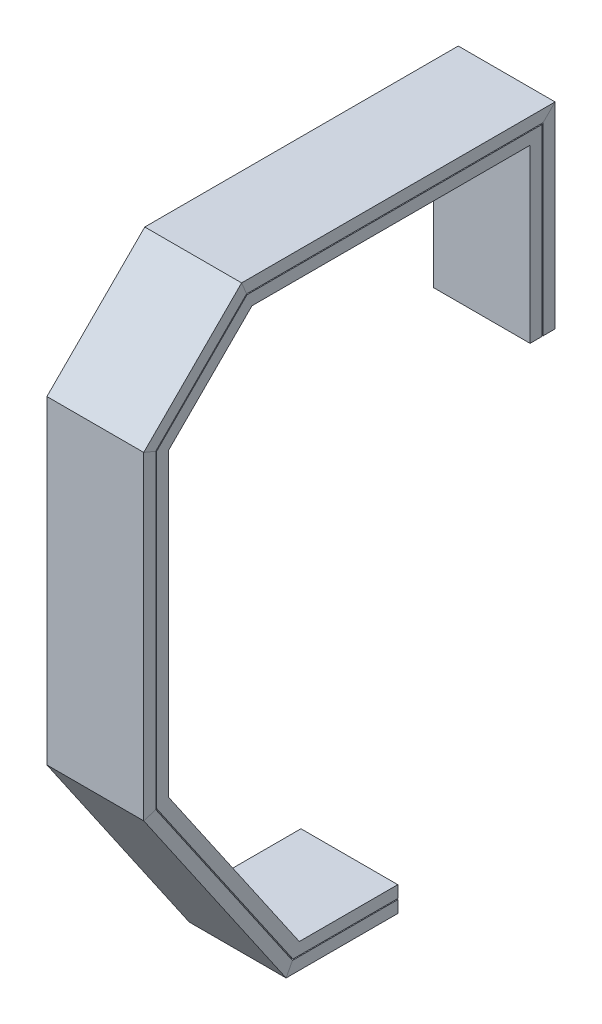
ISO-10303-21;
HEADER;
FILE_DESCRIPTION(('STEP AP214'),'2;1');
FILE_NAME('part.step','',(''),(''),'','','');
FILE_SCHEMA(('AUTOMOTIVE_DESIGN { 1 0 10303 214 1 1 1 1 }'));
ENDSEC;
DATA;
#1=APPLICATION_CONTEXT('core data for automotive mechanical design processes');
#2=APPLICATION_PROTOCOL_DEFINITION('international standard','automotive_design',2000,#1);
#3=PRODUCT_CONTEXT('',#1,'mechanical');
#4=PRODUCT('Part','Part','',(#3));
#5=PRODUCT_RELATED_PRODUCT_CATEGORY('part','',(#4));
#6=PRODUCT_DEFINITION_FORMATION('','',#4);
#7=PRODUCT_DEFINITION_CONTEXT('part definition',#1,'design');
#8=PRODUCT_DEFINITION('design','',#6,#7);
#9=PRODUCT_DEFINITION_SHAPE('','',#8);
#10=(LENGTH_UNIT() NAMED_UNIT(*) SI_UNIT(.MILLI.,.METRE.));
#11=(NAMED_UNIT(*) PLANE_ANGLE_UNIT() SI_UNIT($,.RADIAN.));
#12=(NAMED_UNIT(*) SI_UNIT($,.STERADIAN.) SOLID_ANGLE_UNIT());
#13=UNCERTAINTY_MEASURE_WITH_UNIT(LENGTH_MEASURE(1.E-05),#10,'distance_accuracy_value','');
#14=(GEOMETRIC_REPRESENTATION_CONTEXT(3) GLOBAL_UNCERTAINTY_ASSIGNED_CONTEXT((#13)) GLOBAL_UNIT_ASSIGNED_CONTEXT((#10,
#11,#12)) REPRESENTATION_CONTEXT('',''));
#15=CARTESIAN_POINT('',(0.,0.,0.));
#16=DIRECTION('',(0.,0.,1.));
#17=DIRECTION('',(1.,0.,0.));
#18=AXIS2_PLACEMENT_3D('',#15,#16,#17);
#19=CARTESIAN_POINT('',(25.4,0.,3.655));
#20=DIRECTION('',(0.,-1.,0.));
#21=DIRECTION('',(0.,0.,-1.));
#22=AXIS2_PLACEMENT_3D('',#19,#20,#21);
#23=PLANE('',#22);
#24=DIRECTION('',(0.,0.,1.));
#25=VECTOR('',#24,1.);
#26=CARTESIAN_POINT('',(-25.4,0.,3.655));
#27=LINE('',#26,#25);
#28=CARTESIAN_POINT('',(-25.4,0.,3.655));
#29=VERTEX_POINT('',#28);
#30=CARTESIAN_POINT('',(-25.4,0.,9.965));
#31=VERTEX_POINT('',#30);
#32=EDGE_CURVE('E178',#29,#31,#27,.T.);
#33=ORIENTED_EDGE('',*,*,#32,.F.);
#34=DIRECTION('',(-1.,0.,0.));
#35=VECTOR('',#34,1.);
#36=CARTESIAN_POINT('',(25.4,0.,3.655));
#37=LINE('',#36,#35);
#38=CARTESIAN_POINT('',(25.4,0.,3.655));
#39=VERTEX_POINT('',#38);
#40=EDGE_CURVE('E12',#39,#29,#37,.T.);
#41=ORIENTED_EDGE('',*,*,#40,.F.);
#42=DIRECTION('',(0.,0.,1.));
#43=VECTOR('',#42,1.);
#44=CARTESIAN_POINT('',(25.4,0.,3.655));
#45=LINE('',#44,#43);
#46=CARTESIAN_POINT('',(25.4,0.,9.965));
#47=VERTEX_POINT('',#46);
#48=EDGE_CURVE('E216',#39,#47,#45,.T.);
#49=ORIENTED_EDGE('',*,*,#48,.T.);
#50=DIRECTION('',(-1.,0.,0.));
#51=VECTOR('',#50,1.);
#52=CARTESIAN_POINT('',(25.4,0.,9.965));
#53=LINE('',#52,#51);
#54=EDGE_CURVE('E48',#47,#31,#53,.T.);
#55=ORIENTED_EDGE('',*,*,#54,.T.);
#56=EDGE_LOOP('',(#33,#41,#49,#55));
#57=FACE_BOUND('',#56,.T.);
#58=ADVANCED_FACE('F45',(#57),#23,.T.);
#59=CARTESIAN_POINT('',(25.4,0.,3.655));
#60=DIRECTION('',(0.,0.,-1.));
#61=DIRECTION('',(-1.,0.,0.));
#62=AXIS2_PLACEMENT_3D('',#59,#60,#61);
#63=PLANE('',#62);
#64=DIRECTION('',(0.,-1.,0.));
#65=VECTOR('',#64,1.);
#66=CARTESIAN_POINT('',(-25.4,0.,3.655));
#67=LINE('',#66,#65);
#68=CARTESIAN_POINT('',(-25.4,96.345,3.655));
#69=VERTEX_POINT('',#68);
#70=EDGE_CURVE('E214',#69,#29,#67,.T.);
#71=ORIENTED_EDGE('',*,*,#70,.F.);
#72=DIRECTION('',(-1.,0.,0.));
#73=VECTOR('',#72,1.);
#74=CARTESIAN_POINT('',(25.4,96.345,3.655));
#75=LINE('',#74,#73);
#76=CARTESIAN_POINT('',(25.4,96.345,3.655));
#77=VERTEX_POINT('',#76);
#78=EDGE_CURVE('E54',#77,#69,#75,.T.);
#79=ORIENTED_EDGE('',*,*,#78,.F.);
#80=DIRECTION('',(0.,-1.,0.));
#81=VECTOR('',#80,1.);
#82=CARTESIAN_POINT('',(25.4,0.,3.655));
#83=LINE('',#82,#81);
#84=EDGE_CURVE('E168',#77,#39,#83,.T.);
#85=ORIENTED_EDGE('',*,*,#84,.T.);
#86=ORIENTED_EDGE('',*,*,#40,.T.);
#87=EDGE_LOOP('',(#71,#79,#85,#86));
#88=FACE_BOUND('',#87,.T.);
#89=ADVANCED_FACE('F240',(#88),#63,.T.);
#90=CARTESIAN_POINT('',(25.4,96.345,3.655));
#91=DIRECTION('',(0.,1.,0.));
#92=DIRECTION('',(0.,0.,1.));
#93=AXIS2_PLACEMENT_3D('',#90,#91,#92);
#94=PLANE('',#93);
#95=DIRECTION('',(0.,0.,-1.));
#96=VECTOR('',#95,1.);
#97=CARTESIAN_POINT('',(-25.4,96.345,3.655));
#98=LINE('',#97,#96);
#99=CARTESIAN_POINT('',(-25.4,96.345,158.486049429526));
#100=VERTEX_POINT('',#99);
#101=EDGE_CURVE('E155',#100,#69,#98,.T.);
#102=ORIENTED_EDGE('',*,*,#101,.F.);
#103=DIRECTION('',(-1.,0.,0.));
#104=VECTOR('',#103,1.);
#105=CARTESIAN_POINT('',(25.4,96.345,158.486049429526));
#106=LINE('',#105,#104);
#107=CARTESIAN_POINT('',(25.4,96.345,158.486049429526));
#108=VERTEX_POINT('',#107);
#109=EDGE_CURVE('E150',#108,#100,#106,.T.);
#110=ORIENTED_EDGE('',*,*,#109,.F.);
#111=DIRECTION('',(0.,0.,-1.));
#112=VECTOR('',#111,1.);
#113=CARTESIAN_POINT('',(25.4,96.345,3.655));
#114=LINE('',#113,#112);
#115=EDGE_CURVE('E153',#108,#77,#114,.T.);
#116=ORIENTED_EDGE('',*,*,#115,.T.);
#117=ORIENTED_EDGE('',*,*,#78,.T.);
#118=EDGE_LOOP('',(#102,#110,#116,#117));
#119=FACE_BOUND('',#118,.T.);
#120=ADVANCED_FACE('F152',(#119),#94,.T.);
#121=CARTESIAN_POINT('',(25.4,96.345,158.486049429526));
#122=DIRECTION('',(0.,0.707106781186548,0.707106781186548));
#123=DIRECTION('',(0.,-0.707106781186548,0.707106781186548));
#124=AXIS2_PLACEMENT_3D('',#121,#122,#123);
#125=PLANE('',#124);
#126=DIRECTION('',(0.,0.707106781186547,-0.707106781186547));
#127=VECTOR('',#126,1.);
#128=CARTESIAN_POINT('',(-25.4,96.345,158.486049429526));
#129=LINE('',#128,#127);
#130=CARTESIAN_POINT('',(-25.4,48.9885747464681,205.842474683058));
#131=VERTEX_POINT('',#130);
#132=EDGE_CURVE('E211',#131,#100,#129,.T.);
#133=ORIENTED_EDGE('',*,*,#132,.F.);
#134=DIRECTION('',(-1.,0.,0.));
#135=VECTOR('',#134,1.);
#136=CARTESIAN_POINT('',(25.4,48.9885747464681,205.842474683058));
#137=LINE('',#136,#135);
#138=CARTESIAN_POINT('',(25.4,48.9885747464681,205.842474683058));
#139=VERTEX_POINT('',#138);
#140=EDGE_CURVE('E160',#139,#131,#137,.T.);
#141=ORIENTED_EDGE('',*,*,#140,.F.);
#142=DIRECTION('',(0.,0.707106781186547,-0.707106781186547));
#143=VECTOR('',#142,1.);
#144=CARTESIAN_POINT('',(25.4,96.345,158.486049429526));
#145=LINE('',#144,#143);
#146=EDGE_CURVE('E166',#139,#108,#145,.T.);
#147=ORIENTED_EDGE('',*,*,#146,.T.);
#148=ORIENTED_EDGE('',*,*,#109,.T.);
#149=EDGE_LOOP('',(#133,#141,#147,#148));
#150=FACE_BOUND('',#149,.T.);
#151=ADVANCED_FACE('F170',(#150),#125,.T.);
#152=CARTESIAN_POINT('',(25.4,48.9885747464681,205.842474683058));
#153=DIRECTION('',(0.,0.,1.));
#154=DIRECTION('',(0.,-1.,0.));
#155=AXIS2_PLACEMENT_3D('',#152,#153,#154);
#156=PLANE('',#155);
#157=DIRECTION('',(0.,1.,0.));
#158=VECTOR('',#157,1.);
#159=CARTESIAN_POINT('',(-25.4,48.9885747464681,205.842474683058));
#160=LINE('',#159,#158);
#161=CARTESIAN_POINT('',(-25.4,-113.473168770734,205.842474683058));
#162=VERTEX_POINT('',#161);
#163=EDGE_CURVE('E208',#162,#131,#160,.T.);
#164=ORIENTED_EDGE('',*,*,#163,.F.);
#165=DIRECTION('',(-1.,0.,0.));
#166=VECTOR('',#165,1.);
#167=CARTESIAN_POINT('',(25.4,-113.473168770734,205.842474683058));
#168=LINE('',#167,#166);
#169=CARTESIAN_POINT('',(25.4,-113.473168770734,205.842474683058));
#170=VERTEX_POINT('',#169);
#171=EDGE_CURVE('E220',#170,#162,#168,.T.);
#172=ORIENTED_EDGE('',*,*,#171,.F.);
#173=DIRECTION('',(0.,1.,0.));
#174=VECTOR('',#173,1.);
#175=CARTESIAN_POINT('',(25.4,48.9885747464681,205.842474683058));
#176=LINE('',#175,#174);
#177=EDGE_CURVE('E171',#170,#139,#176,.T.);
#178=ORIENTED_EDGE('',*,*,#177,.T.);
#179=ORIENTED_EDGE('',*,*,#140,.T.);
#180=EDGE_LOOP('',(#164,#172,#178,#179));
#181=FACE_BOUND('',#180,.T.);
#182=ADVANCED_FACE('F253',(#181),#156,.T.);
#183=CARTESIAN_POINT('',(25.4,-113.473168770734,205.842474683058));
#184=DIRECTION('',(0.,-0.566158696964165,0.82429626339796));
#185=DIRECTION('',(0.,-0.82429626339796,-0.566158696964165));
#186=AXIS2_PLACEMENT_3D('',#183,#184,#185);
#187=PLANE('',#186);
#188=DIRECTION('',(0.,0.82429626339796,0.566158696964165));
#189=VECTOR('',#188,1.);
#190=CARTESIAN_POINT('',(-25.4,-113.473168770734,205.842474683058));
#191=LINE('',#190,#189);
#192=CARTESIAN_POINT('',(-25.4,-217.522474683058,134.377369148657));
#193=VERTEX_POINT('',#192);
#194=EDGE_CURVE('E205',#193,#162,#191,.T.);
#195=ORIENTED_EDGE('',*,*,#194,.F.);
#196=DIRECTION('',(-1.,0.,0.));
#197=VECTOR('',#196,1.);
#198=CARTESIAN_POINT('',(25.4,-217.522474683058,134.377369148657));
#199=LINE('',#198,#197);
#200=CARTESIAN_POINT('',(25.4,-217.522474683058,134.377369148657));
#201=VERTEX_POINT('',#200);
#202=EDGE_CURVE('E222',#201,#193,#199,.T.);
#203=ORIENTED_EDGE('',*,*,#202,.F.);
#204=DIRECTION('',(0.,0.82429626339796,0.566158696964165));
#205=VECTOR('',#204,1.);
#206=CARTESIAN_POINT('',(25.4,-113.473168770734,205.842474683058));
#207=LINE('',#206,#205);
#208=EDGE_CURVE('E173',#201,#170,#207,.T.);
#209=ORIENTED_EDGE('',*,*,#208,.T.);
#210=ORIENTED_EDGE('',*,*,#171,.T.);
#211=EDGE_LOOP('',(#195,#203,#209,#210));
#212=FACE_BOUND('',#211,.T.);
#213=ADVANCED_FACE('F256',(#212),#187,.T.);
#214=CARTESIAN_POINT('',(25.4,-217.522474683058,134.377369148657));
#215=DIRECTION('',(0.,-1.,0.));
#216=DIRECTION('',(0.,0.,-1.));
#217=AXIS2_PLACEMENT_3D('',#214,#215,#216);
#218=PLANE('',#217);
#219=DIRECTION('',(0.,0.,1.));
#220=VECTOR('',#219,1.);
#221=CARTESIAN_POINT('',(-25.4,-217.522474683058,134.377369148657));
#222=LINE('',#221,#220);
#223=CARTESIAN_POINT('',(-25.4,-217.522474683058,79.3710585222564));
#224=VERTEX_POINT('',#223);
#225=EDGE_CURVE('E202',#224,#193,#222,.T.);
#226=ORIENTED_EDGE('',*,*,#225,.F.);
#227=DIRECTION('',(-1.,0.,0.));
#228=VECTOR('',#227,1.);
#229=CARTESIAN_POINT('',(25.4,-217.522474683058,79.3710585222564));
#230=LINE('',#229,#228);
#231=CARTESIAN_POINT('',(25.4,-217.522474683058,79.3710585222564));
#232=VERTEX_POINT('',#231);
#233=EDGE_CURVE('E224',#232,#224,#230,.T.);
#234=ORIENTED_EDGE('',*,*,#233,.F.);
#235=DIRECTION('',(0.,0.,1.));
#236=VECTOR('',#235,1.);
#237=CARTESIAN_POINT('',(25.4,-217.522474683058,134.377369148657));
#238=LINE('',#237,#236);
#239=EDGE_CURVE('E413',#232,#201,#238,.T.);
#240=ORIENTED_EDGE('',*,*,#239,.T.);
#241=ORIENTED_EDGE('',*,*,#202,.T.);
#242=EDGE_LOOP('',(#226,#234,#240,#241));
#243=FACE_BOUND('',#242,.T.);
#244=ADVANCED_FACE('F260',(#243),#218,.T.);
#245=CARTESIAN_POINT('',(25.4,-211.212474683058,79.3710585222564));
#246=DIRECTION('',(0.,0.,-1.));
#247=DIRECTION('',(-1.,0.,0.));
#248=AXIS2_PLACEMENT_3D('',#245,#246,#247);
#249=PLANE('',#248);
#250=DIRECTION('',(0.,-1.,0.));
#251=VECTOR('',#250,1.);
#252=CARTESIAN_POINT('',(-25.4,-211.212474683058,79.3710585222564));
#253=LINE('',#252,#251);
#254=CARTESIAN_POINT('',(-25.4,-211.212474683058,79.3710585222564));
#255=VERTEX_POINT('',#254);
#256=EDGE_CURVE('E199',#255,#224,#253,.T.);
#257=ORIENTED_EDGE('',*,*,#256,.F.);
#258=DIRECTION('',(-1.,0.,0.));
#259=VECTOR('',#258,1.);
#260=CARTESIAN_POINT('',(25.4,-211.212474683058,79.3710585222564));
#261=LINE('',#260,#259);
#262=CARTESIAN_POINT('',(25.4,-211.212474683058,79.3710585222564));
#263=VERTEX_POINT('',#262);
#264=EDGE_CURVE('E226',#263,#255,#261,.T.);
#265=ORIENTED_EDGE('',*,*,#264,.F.);
#266=DIRECTION('',(0.,-1.,0.));
#267=VECTOR('',#266,1.);
#268=CARTESIAN_POINT('',(25.4,-211.212474683058,79.3710585222564));
#269=LINE('',#268,#267);
#270=EDGE_CURVE('E406',#263,#232,#269,.T.);
#271=ORIENTED_EDGE('',*,*,#270,.T.);
#272=ORIENTED_EDGE('',*,*,#233,.T.);
#273=EDGE_LOOP('',(#257,#265,#271,#272));
#274=FACE_BOUND('',#273,.T.);
#275=ADVANCED_FACE('F264',(#274),#249,.T.);
#276=CARTESIAN_POINT('',(25.4,-211.212474683058,131.056307603539));
#277=DIRECTION('',(0.,1.,0.));
#278=DIRECTION('',(0.,0.,1.));
#279=AXIS2_PLACEMENT_3D('',#276,#277,#278);
#280=PLANE('',#279);
#281=DIRECTION('',(0.,0.,-1.));
#282=VECTOR('',#281,1.);
#283=CARTESIAN_POINT('',(-25.4,-211.212474683058,131.056307603539));
#284=LINE('',#283,#282);
#285=CARTESIAN_POINT('',(-25.4,-211.212474683058,131.056307603539));
#286=VERTEX_POINT('',#285);
#287=EDGE_CURVE('E196',#286,#255,#284,.T.);
#288=ORIENTED_EDGE('',*,*,#287,.F.);
#289=DIRECTION('',(-1.,0.,0.));
#290=VECTOR('',#289,1.);
#291=CARTESIAN_POINT('',(25.4,-211.212474683058,131.056307603539));
#292=LINE('',#291,#290);
#293=CARTESIAN_POINT('',(25.4,-211.212474683058,131.056307603539));
#294=VERTEX_POINT('',#293);
#295=EDGE_CURVE('E228',#294,#286,#292,.T.);
#296=ORIENTED_EDGE('',*,*,#295,.F.);
#297=DIRECTION('',(0.,0.,-1.));
#298=VECTOR('',#297,1.);
#299=CARTESIAN_POINT('',(25.4,-211.212474683058,131.056307603539));
#300=LINE('',#299,#298);
#301=EDGE_CURVE('E402',#294,#263,#300,.T.);
#302=ORIENTED_EDGE('',*,*,#301,.T.);
#303=ORIENTED_EDGE('',*,*,#264,.T.);
#304=EDGE_LOOP('',(#288,#296,#302,#303));
#305=FACE_BOUND('',#304,.T.);
#306=ADVANCED_FACE('F268',(#305),#280,.T.);
#307=CARTESIAN_POINT('',(25.4,-111.514900560948,199.532474683058));
#308=DIRECTION('',(0.,0.566158696964165,-0.82429626339796));
#309=DIRECTION('',(0.,0.82429626339796,0.566158696964165));
#310=AXIS2_PLACEMENT_3D('',#307,#308,#309);
#311=PLANE('',#310);
#312=DIRECTION('',(0.,-0.82429626339796,-0.566158696964165));
#313=VECTOR('',#312,1.);
#314=CARTESIAN_POINT('',(-25.4,-111.514900560948,199.532474683058));
#315=LINE('',#314,#313);
#316=CARTESIAN_POINT('',(-25.4,-111.514900560948,199.532474683058));
#317=VERTEX_POINT('',#316);
#318=EDGE_CURVE('E193',#317,#286,#315,.T.);
#319=ORIENTED_EDGE('',*,*,#318,.F.);
#320=DIRECTION('',(-1.,0.,0.));
#321=VECTOR('',#320,1.);
#322=CARTESIAN_POINT('',(25.4,-111.514900560948,199.532474683058));
#323=LINE('',#322,#321);
#324=CARTESIAN_POINT('',(25.4,-111.514900560948,199.532474683058));
#325=VERTEX_POINT('',#324);
#326=EDGE_CURVE('E230',#325,#317,#323,.T.);
#327=ORIENTED_EDGE('',*,*,#326,.F.);
#328=DIRECTION('',(0.,-0.82429626339796,-0.566158696964165));
#329=VECTOR('',#328,1.);
#330=CARTESIAN_POINT('',(25.4,-111.514900560948,199.532474683058));
#331=LINE('',#330,#329);
#332=EDGE_CURVE('E418',#325,#294,#331,.T.);
#333=ORIENTED_EDGE('',*,*,#332,.T.);
#334=ORIENTED_EDGE('',*,*,#295,.T.);
#335=EDGE_LOOP('',(#319,#327,#333,#334));
#336=FACE_BOUND('',#335,.T.);
#337=ADVANCED_FACE('F272',(#336),#311,.T.);
#338=CARTESIAN_POINT('',(25.4,46.3748871678937,199.532474683058));
#339=DIRECTION('',(0.,0.,-1.));
#340=DIRECTION('',(0.,1.,0.));
#341=AXIS2_PLACEMENT_3D('',#338,#339,#340);
#342=PLANE('',#341);
#343=DIRECTION('',(0.,-1.,0.));
#344=VECTOR('',#343,1.);
#345=CARTESIAN_POINT('',(-25.4,46.3748871678937,199.532474683058));
#346=LINE('',#345,#344);
#347=CARTESIAN_POINT('',(-25.4,46.3748871678937,199.532474683058));
#348=VERTEX_POINT('',#347);
#349=EDGE_CURVE('E190',#348,#317,#346,.T.);
#350=ORIENTED_EDGE('',*,*,#349,.F.);
#351=DIRECTION('',(-1.,0.,0.));
#352=VECTOR('',#351,1.);
#353=CARTESIAN_POINT('',(25.4,46.3748871678937,199.532474683058));
#354=LINE('',#353,#352);
#355=CARTESIAN_POINT('',(25.4,46.3748871678937,199.532474683058));
#356=VERTEX_POINT('',#355);
#357=EDGE_CURVE('E232',#356,#348,#354,.T.);
#358=ORIENTED_EDGE('',*,*,#357,.F.);
#359=DIRECTION('',(0.,-1.,0.));
#360=VECTOR('',#359,1.);
#361=CARTESIAN_POINT('',(25.4,46.3748871678937,199.532474683058));
#362=LINE('',#361,#360);
#363=EDGE_CURVE('E395',#356,#325,#362,.T.);
#364=ORIENTED_EDGE('',*,*,#363,.T.);
#365=ORIENTED_EDGE('',*,*,#326,.T.);
#366=EDGE_LOOP('',(#350,#358,#364,#365));
#367=FACE_BOUND('',#366,.T.);
#368=ADVANCED_FACE('F276',(#367),#342,.T.);
#369=CARTESIAN_POINT('',(25.4,90.035,155.872361850952));
#370=DIRECTION('',(0.,-0.707106781186547,-0.707106781186548));
#371=DIRECTION('',(0.,0.707106781186548,-0.707106781186547));
#372=AXIS2_PLACEMENT_3D('',#369,#370,#371);
#373=PLANE('',#372);
#374=DIRECTION('',(0.,-0.707106781186549,0.707106781186547));
#375=VECTOR('',#374,1.);
#376=CARTESIAN_POINT('',(-25.4,90.035,155.872361850952));
#377=LINE('',#376,#375);
#378=CARTESIAN_POINT('',(-25.4,90.035,155.872361850952));
#379=VERTEX_POINT('',#378);
#380=EDGE_CURVE('E187',#379,#348,#377,.T.);
#381=ORIENTED_EDGE('',*,*,#380,.F.);
#382=DIRECTION('',(-1.,0.,0.));
#383=VECTOR('',#382,1.);
#384=CARTESIAN_POINT('',(25.4,90.035,155.872361850952));
#385=LINE('',#384,#383);
#386=CARTESIAN_POINT('',(25.4,90.035,155.872361850952));
#387=VERTEX_POINT('',#386);
#388=EDGE_CURVE('E234',#387,#379,#385,.T.);
#389=ORIENTED_EDGE('',*,*,#388,.F.);
#390=DIRECTION('',(0.,-0.707106781186549,0.707106781186547));
#391=VECTOR('',#390,1.);
#392=CARTESIAN_POINT('',(25.4,90.035,155.872361850952));
#393=LINE('',#392,#391);
#394=EDGE_CURVE('E391',#387,#356,#393,.T.);
#395=ORIENTED_EDGE('',*,*,#394,.T.);
#396=ORIENTED_EDGE('',*,*,#357,.T.);
#397=EDGE_LOOP('',(#381,#389,#395,#396));
#398=FACE_BOUND('',#397,.T.);
#399=ADVANCED_FACE('F280',(#398),#373,.T.);
#400=CARTESIAN_POINT('',(25.4,90.035,9.965));
#401=DIRECTION('',(0.,-1.,0.));
#402=DIRECTION('',(0.,0.,-1.));
#403=AXIS2_PLACEMENT_3D('',#400,#401,#402);
#404=PLANE('',#403);
#405=DIRECTION('',(0.,0.,1.));
#406=VECTOR('',#405,1.);
#407=CARTESIAN_POINT('',(-25.4,90.035,9.965));
#408=LINE('',#407,#406);
#409=CARTESIAN_POINT('',(-25.4,90.035,9.965));
#410=VERTEX_POINT('',#409);
#411=EDGE_CURVE('E184',#410,#379,#408,.T.);
#412=ORIENTED_EDGE('',*,*,#411,.F.);
#413=DIRECTION('',(-1.,0.,0.));
#414=VECTOR('',#413,1.);
#415=CARTESIAN_POINT('',(25.4,90.035,9.965));
#416=LINE('',#415,#414);
#417=CARTESIAN_POINT('',(25.4,90.035,9.965));
#418=VERTEX_POINT('',#417);
#419=EDGE_CURVE('E235',#418,#410,#416,.T.);
#420=ORIENTED_EDGE('',*,*,#419,.F.);
#421=DIRECTION('',(0.,0.,1.));
#422=VECTOR('',#421,1.);
#423=CARTESIAN_POINT('',(25.4,90.035,9.965));
#424=LINE('',#423,#422);
#425=EDGE_CURVE('E422',#418,#387,#424,.T.);
#426=ORIENTED_EDGE('',*,*,#425,.T.);
#427=ORIENTED_EDGE('',*,*,#388,.T.);
#428=EDGE_LOOP('',(#412,#420,#426,#427));
#429=FACE_BOUND('',#428,.T.);
#430=ADVANCED_FACE('F284',(#429),#404,.T.);
#431=CARTESIAN_POINT('',(25.4,0.,9.965));
#432=DIRECTION('',(0.,0.,1.));
#433=DIRECTION('',(1.,0.,0.));
#434=AXIS2_PLACEMENT_3D('',#431,#432,#433);
#435=PLANE('',#434);
#436=DIRECTION('',(0.,1.,0.));
#437=VECTOR('',#436,1.);
#438=CARTESIAN_POINT('',(-25.4,0.,9.965));
#439=LINE('',#438,#437);
#440=EDGE_CURVE('E181',#31,#410,#439,.T.);
#441=ORIENTED_EDGE('',*,*,#440,.F.);
#442=ORIENTED_EDGE('',*,*,#54,.F.);
#443=DIRECTION('',(0.,1.,0.));
#444=VECTOR('',#443,1.);
#445=CARTESIAN_POINT('',(25.4,0.,9.965));
#446=LINE('',#445,#444);
#447=EDGE_CURVE('E424',#47,#418,#446,.T.);
#448=ORIENTED_EDGE('',*,*,#447,.T.);
#449=ORIENTED_EDGE('',*,*,#419,.T.);
#450=EDGE_LOOP('',(#441,#442,#448,#449));
#451=FACE_BOUND('',#450,.T.);
#452=ADVANCED_FACE('F237',(#451),#435,.T.);
#453=CARTESIAN_POINT('',(25.4,0.,0.));
#454=DIRECTION('',(-1.,0.,0.));
#455=DIRECTION('',(0.,0.,1.));
#456=AXIS2_PLACEMENT_3D('',#453,#454,#455);
#457=PLANE('',#456);
#458=ORIENTED_EDGE('',*,*,#48,.F.);
#459=ORIENTED_EDGE('',*,*,#84,.F.);
#460=ORIENTED_EDGE('',*,*,#115,.F.);
#461=ORIENTED_EDGE('',*,*,#146,.F.);
#462=ORIENTED_EDGE('',*,*,#177,.F.);
#463=ORIENTED_EDGE('',*,*,#208,.F.);
#464=ORIENTED_EDGE('',*,*,#239,.F.);
#465=ORIENTED_EDGE('',*,*,#270,.F.);
#466=ORIENTED_EDGE('',*,*,#301,.F.);
#467=ORIENTED_EDGE('',*,*,#332,.F.);
#468=ORIENTED_EDGE('',*,*,#363,.F.);
#469=ORIENTED_EDGE('',*,*,#394,.F.);
#470=ORIENTED_EDGE('',*,*,#425,.F.);
#471=ORIENTED_EDGE('',*,*,#447,.F.);
#472=EDGE_LOOP('',(#458,#459,#460,#461,#462,#463,#464,#465,#466,#467,#468,#469,#470,#471));
#473=FACE_BOUND('',#472,.T.);
#474=ADVANCED_FACE('F164',(#473),#457,.F.);
#475=CARTESIAN_POINT('',(-25.4,0.,0.));
#476=DIRECTION('',(-1.,0.,0.));
#477=DIRECTION('',(0.,0.,1.));
#478=AXIS2_PLACEMENT_3D('',#475,#476,#477);
#479=PLANE('',#478);
#480=ORIENTED_EDGE('',*,*,#32,.T.);
#481=ORIENTED_EDGE('',*,*,#440,.T.);
#482=ORIENTED_EDGE('',*,*,#411,.T.);
#483=ORIENTED_EDGE('',*,*,#380,.T.);
#484=ORIENTED_EDGE('',*,*,#349,.T.);
#485=ORIENTED_EDGE('',*,*,#318,.T.);
#486=ORIENTED_EDGE('',*,*,#287,.T.);
#487=ORIENTED_EDGE('',*,*,#256,.T.);
#488=ORIENTED_EDGE('',*,*,#225,.T.);
#489=ORIENTED_EDGE('',*,*,#194,.T.);
#490=ORIENTED_EDGE('',*,*,#163,.T.);
#491=ORIENTED_EDGE('',*,*,#132,.T.);
#492=ORIENTED_EDGE('',*,*,#101,.T.);
#493=ORIENTED_EDGE('',*,*,#70,.T.);
#494=EDGE_LOOP('',(#480,#481,#482,#483,#484,#485,#486,#487,#488,#489,#490,#491,#492,#493));
#495=FACE_BOUND('',#494,.T.);
#496=ADVANCED_FACE('F239',(#495),#479,.T.);
#497=CLOSED_SHELL('',(#58,#89,#120,#151,#182,#213,#244,#275,#306,#337,#368,#399,#430,#452,#474,#496));
#498=MANIFOLD_SOLID_BREP('B2',#497);
#499=CARTESIAN_POINT('',(0.,-221.177474683058,79.3710585222564));
#500=DIRECTION('',(0.,0.,-1.));
#501=DIRECTION('',(0.,1.,0.));
#502=AXIS2_PLACEMENT_3D('',#499,#500,#501);
#503=PLANE('',#502);
#504=DIRECTION('',(0.,-1.,0.));
#505=VECTOR('',#504,1.);
#506=CARTESIAN_POINT('',(25.4,-224.332474683058,79.3710585222564));
#507=LINE('',#506,#505);
#508=CARTESIAN_POINT('',(25.4,-218.022474683058,79.3710585222564));
#509=VERTEX_POINT('',#508);
#510=CARTESIAN_POINT('',(25.4,-224.332474683058,79.3710585222564));
#511=VERTEX_POINT('',#510);
#512=EDGE_CURVE('E516',#509,#511,#507,.T.);
#513=ORIENTED_EDGE('',*,*,#512,.T.);
#514=DIRECTION('',(-1.,0.,0.));
#515=VECTOR('',#514,1.);
#516=CARTESIAN_POINT('',(-25.4,-224.332474683058,79.3710585222564));
#517=LINE('',#516,#515);
#518=CARTESIAN_POINT('',(-25.4,-224.332474683058,79.3710585222564));
#519=VERTEX_POINT('',#518);
#520=EDGE_CURVE('E514',#511,#519,#517,.T.);
#521=ORIENTED_EDGE('',*,*,#520,.T.);
#522=DIRECTION('',(0.,1.,0.));
#523=VECTOR('',#522,1.);
#524=CARTESIAN_POINT('',(-25.4,-224.332474683058,79.3710585222564));
#525=LINE('',#524,#523);
#526=CARTESIAN_POINT('',(-25.4,-218.022474683058,79.3710585222564));
#527=VERTEX_POINT('',#526);
#528=EDGE_CURVE('E511',#519,#527,#525,.T.);
#529=ORIENTED_EDGE('',*,*,#528,.T.);
#530=DIRECTION('',(1.,0.,0.));
#531=VECTOR('',#530,1.);
#532=CARTESIAN_POINT('',(-25.4,-218.022474683058,79.3710585222564));
#533=LINE('',#532,#531);
#534=EDGE_CURVE('E530',#527,#509,#533,.T.);
#535=ORIENTED_EDGE('',*,*,#534,.T.);
#536=EDGE_LOOP('',(#513,#521,#529,#535));
#537=FACE_BOUND('',#536,.T.);
#538=ADVANCED_FACE('F429',(#537),#503,.T.);
#539=CARTESIAN_POINT('',(0.,0.,0.));
#540=DIRECTION('',(0.,1.,0.));
#541=DIRECTION('',(0.,0.,1.));
#542=AXIS2_PLACEMENT_3D('',#539,#540,#541);
#543=PLANE('',#542);
#544=DIRECTION('',(0.,0.,-1.));
#545=VECTOR('',#544,1.);
#546=CARTESIAN_POINT('',(25.4,0.,-3.155));
#547=LINE('',#546,#545);
#548=CARTESIAN_POINT('',(25.4,0.,3.155));
#549=VERTEX_POINT('',#548);
#550=CARTESIAN_POINT('',(25.4,0.,-3.155));
#551=VERTEX_POINT('',#550);
#552=EDGE_CURVE('E644',#549,#551,#547,.T.);
#553=ORIENTED_EDGE('',*,*,#552,.F.);
#554=DIRECTION('',(1.,0.,0.));
#555=VECTOR('',#554,1.);
#556=CARTESIAN_POINT('',(-25.4,0.,3.155));
#557=LINE('',#556,#555);
#558=CARTESIAN_POINT('',(-25.4,0.,3.155));
#559=VERTEX_POINT('',#558);
#560=EDGE_CURVE('E650',#559,#549,#557,.T.);
#561=ORIENTED_EDGE('',*,*,#560,.F.);
#562=DIRECTION('',(0.,0.,1.));
#563=VECTOR('',#562,1.);
#564=CARTESIAN_POINT('',(-25.4,0.,-3.155));
#565=LINE('',#564,#563);
#566=CARTESIAN_POINT('',(-25.4,0.,-3.155));
#567=VERTEX_POINT('',#566);
#568=EDGE_CURVE('E634',#567,#559,#565,.T.);
#569=ORIENTED_EDGE('',*,*,#568,.F.);
#570=DIRECTION('',(-1.,0.,0.));
#571=VECTOR('',#570,1.);
#572=CARTESIAN_POINT('',(-25.4,0.,-3.155));
#573=LINE('',#572,#571);
#574=EDGE_CURVE('E640',#551,#567,#573,.T.);
#575=ORIENTED_EDGE('',*,*,#574,.F.);
#576=EDGE_LOOP('',(#553,#561,#569,#575));
#577=FACE_BOUND('',#576,.T.);
#578=ADVANCED_FACE('F683',(#577),#543,.F.);
#579=CARTESIAN_POINT('',(-25.4,-224.332474683058,138.227642372072));
#580=DIRECTION('',(-1.,0.,0.));
#581=DIRECTION('',(0.,-1.,0.));
#582=AXIS2_PLACEMENT_3D('',#579,#580,#581);
#583=PLANE('',#582);
#584=DIRECTION('',(0.,-0.884917707180777,0.4657474117136));
#585=VECTOR('',#584,1.);
#586=CARTESIAN_POINT('',(-25.4,-169.877972093134,109.30124785108));
#587=LINE('',#586,#585);
#588=CARTESIAN_POINT('',(-25.4,-218.022474683058,134.640527749697));
#589=VERTEX_POINT('',#588);
#590=CARTESIAN_POINT('',(-25.4,-224.332474683058,137.961589294816));
#591=VERTEX_POINT('',#590);
#592=EDGE_CURVE('E546',#589,#591,#587,.T.);
#593=ORIENTED_EDGE('',*,*,#592,.F.);
#594=DIRECTION('',(0.,0.,-1.));
#595=VECTOR('',#594,1.);
#596=CARTESIAN_POINT('',(-25.4,-218.022474683058,138.227642372072));
#597=LINE('',#596,#595);
#598=EDGE_CURVE('E528',#589,#527,#597,.T.);
#599=ORIENTED_EDGE('',*,*,#598,.T.);
#600=ORIENTED_EDGE('',*,*,#528,.F.);
#601=DIRECTION('',(0.,0.,-1.));
#602=VECTOR('',#601,1.);
#603=CARTESIAN_POINT('',(-25.4,-224.332474683058,138.227642372072));
#604=LINE('',#603,#602);
#605=EDGE_CURVE('E432',#591,#519,#604,.T.);
#606=ORIENTED_EDGE('',*,*,#605,.F.);
#607=EDGE_LOOP('',(#593,#599,#600,#606));
#608=FACE_BOUND('',#607,.T.);
#609=ADVANCED_FACE('F525',(#608),#583,.T.);
#610=CARTESIAN_POINT('',(-25.4,-218.022474683058,138.227642372072));
#611=DIRECTION('',(0.,1.,0.));
#612=DIRECTION('',(-1.,0.,0.));
#613=AXIS2_PLACEMENT_3D('',#610,#611,#612);
#614=PLANE('',#613);
#615=DIRECTION('',(-1.,0.,0.));
#616=VECTOR('',#615,1.);
#617=CARTESIAN_POINT('',(-25.4,-218.022474683058,134.640527749697));
#618=LINE('',#617,#616);
#619=CARTESIAN_POINT('',(25.4,-218.022474683058,134.640527749697));
#620=VERTEX_POINT('',#619);
#621=EDGE_CURVE('E560',#620,#589,#618,.T.);
#622=ORIENTED_EDGE('',*,*,#621,.F.);
#623=DIRECTION('',(0.,0.,-1.));
#624=VECTOR('',#623,1.);
#625=CARTESIAN_POINT('',(25.4,-218.022474683058,138.227642372072));
#626=LINE('',#625,#624);
#627=EDGE_CURVE('E539',#620,#509,#626,.T.);
#628=ORIENTED_EDGE('',*,*,#627,.T.);
#629=ORIENTED_EDGE('',*,*,#534,.F.);
#630=ORIENTED_EDGE('',*,*,#598,.F.);
#631=EDGE_LOOP('',(#622,#628,#629,#630));
#632=FACE_BOUND('',#631,.T.);
#633=ADVANCED_FACE('F740',(#632),#614,.T.);
#634=CARTESIAN_POINT('',(25.4,-224.332474683058,138.227642372072));
#635=DIRECTION('',(1.,0.,0.));
#636=DIRECTION('',(0.,1.,0.));
#637=AXIS2_PLACEMENT_3D('',#634,#635,#636);
#638=PLANE('',#637);
#639=DIRECTION('',(0.,0.884917707180777,-0.4657474117136));
#640=VECTOR('',#639,1.);
#641=CARTESIAN_POINT('',(25.4,-169.877972093134,109.30124785108));
#642=LINE('',#641,#640);
#643=CARTESIAN_POINT('',(25.4,-224.332474683058,137.961589294816));
#644=VERTEX_POINT('',#643);
#645=EDGE_CURVE('E557',#644,#620,#642,.T.);
#646=ORIENTED_EDGE('',*,*,#645,.F.);
#647=DIRECTION('',(0.,0.,-1.));
#648=VECTOR('',#647,1.);
#649=CARTESIAN_POINT('',(25.4,-224.332474683058,138.227642372072));
#650=LINE('',#649,#648);
#651=EDGE_CURVE('E529',#644,#511,#650,.T.);
#652=ORIENTED_EDGE('',*,*,#651,.T.);
#653=ORIENTED_EDGE('',*,*,#512,.F.);
#654=ORIENTED_EDGE('',*,*,#627,.F.);
#655=EDGE_LOOP('',(#646,#652,#653,#654));
#656=FACE_BOUND('',#655,.T.);
#657=ADVANCED_FACE('F743',(#656),#638,.T.);
#658=CARTESIAN_POINT('',(-25.4,-224.332474683058,138.227642372072));
#659=DIRECTION('',(0.,-1.,0.));
#660=DIRECTION('',(1.,0.,0.));
#661=AXIS2_PLACEMENT_3D('',#658,#659,#660);
#662=PLANE('',#661);
#663=DIRECTION('',(1.,0.,0.));
#664=VECTOR('',#663,1.);
#665=CARTESIAN_POINT('',(-25.4,-224.332474683058,137.961589294816));
#666=LINE('',#665,#664);
#667=EDGE_CURVE('E534',#591,#644,#666,.T.);
#668=ORIENTED_EDGE('',*,*,#667,.F.);
#669=ORIENTED_EDGE('',*,*,#605,.T.);
#670=ORIENTED_EDGE('',*,*,#520,.F.);
#671=ORIENTED_EDGE('',*,*,#651,.F.);
#672=EDGE_LOOP('',(#668,#669,#670,#671));
#673=FACE_BOUND('',#672,.T.);
#674=ADVANCED_FACE('F532',(#673),#662,.T.);
#675=CARTESIAN_POINT('',(-25.4,-115.423469503209,212.764525081653));
#676=DIRECTION('',(0.,-0.566158696964165,0.82429626339796));
#677=DIRECTION('',(0.,-0.82429626339796,-0.566158696964165));
#678=AXIS2_PLACEMENT_3D('',#675,#676,#677);
#679=PLANE('',#678);
#680=DIRECTION('',(0.,-0.82429626339796,-0.566158696964165));
#681=VECTOR('',#680,1.);
#682=CARTESIAN_POINT('',(-25.4,-115.423469503209,212.764525081653));
#683=LINE('',#682,#681);
#684=CARTESIAN_POINT('',(-25.4,-115.586608787951,212.652474683058));
#685=VERTEX_POINT('',#684);
#686=EDGE_CURVE('E548',#685,#591,#683,.T.);
#687=ORIENTED_EDGE('',*,*,#686,.T.);
#688=ORIENTED_EDGE('',*,*,#667,.T.);
#689=DIRECTION('',(0.,-0.82429626339796,-0.566158696964165));
#690=VECTOR('',#689,1.);
#691=CARTESIAN_POINT('',(25.4,-115.423469503209,212.764525081653));
#692=LINE('',#691,#690);
#693=CARTESIAN_POINT('',(25.4,-115.586608787951,212.652474683058));
#694=VERTEX_POINT('',#693);
#695=EDGE_CURVE('E535',#694,#644,#692,.T.);
#696=ORIENTED_EDGE('',*,*,#695,.F.);
#697=DIRECTION('',(1.,0.,0.));
#698=VECTOR('',#697,1.);
#699=CARTESIAN_POINT('',(-25.4,-115.586608787951,212.652474683058));
#700=LINE('',#699,#698);
#701=EDGE_CURVE('E567',#685,#694,#700,.T.);
#702=ORIENTED_EDGE('',*,*,#701,.F.);
#703=EDGE_LOOP('',(#687,#688,#696,#702));
#704=FACE_BOUND('',#703,.T.);
#705=ADVANCED_FACE('F736',(#704),#679,.T.);
#706=CARTESIAN_POINT('',(25.4,-115.423469503209,212.764525081653));
#707=DIRECTION('',(1.,0.,0.));
#708=DIRECTION('',(0.,0.,-1.));
#709=AXIS2_PLACEMENT_3D('',#706,#707,#708);
#710=PLANE('',#709);
#711=ORIENTED_EDGE('',*,*,#695,.T.);
#712=ORIENTED_EDGE('',*,*,#645,.T.);
#713=DIRECTION('',(0.,-0.82429626339796,-0.566158696964165));
#714=VECTOR('',#713,1.);
#715=CARTESIAN_POINT('',(25.4,-111.851008125365,207.563215659611));
#716=LINE('',#715,#714);
#717=CARTESIAN_POINT('',(25.4,-113.628340578165,206.342474683058));
#718=VERTEX_POINT('',#717);
#719=EDGE_CURVE('E537',#718,#620,#716,.T.);
#720=ORIENTED_EDGE('',*,*,#719,.F.);
#721=DIRECTION('',(0.,0.296398158396809,-0.955064464682348));
#722=VECTOR('',#721,1.);
#723=CARTESIAN_POINT('',(25.4,-100.860293330195,165.200828338561));
#724=LINE('',#723,#722);
#725=EDGE_CURVE('E581',#694,#718,#724,.T.);
#726=ORIENTED_EDGE('',*,*,#725,.F.);
#727=EDGE_LOOP('',(#711,#712,#720,#726));
#728=FACE_BOUND('',#727,.T.);
#729=ADVANCED_FACE('F727',(#728),#710,.T.);
#730=CARTESIAN_POINT('',(-25.4,-111.851008125365,207.563215659611));
#731=DIRECTION('',(0.,0.566158696964165,-0.82429626339796));
#732=DIRECTION('',(0.,0.82429626339796,0.566158696964165));
#733=AXIS2_PLACEMENT_3D('',#730,#731,#732);
#734=PLANE('',#733);
#735=ORIENTED_EDGE('',*,*,#719,.T.);
#736=ORIENTED_EDGE('',*,*,#621,.T.);
#737=DIRECTION('',(0.,-0.82429626339796,-0.566158696964165));
#738=VECTOR('',#737,1.);
#739=CARTESIAN_POINT('',(-25.4,-111.851008125365,207.563215659611));
#740=LINE('',#739,#738);
#741=CARTESIAN_POINT('',(-25.4,-113.628340578165,206.342474683058));
#742=VERTEX_POINT('',#741);
#743=EDGE_CURVE('E551',#742,#589,#740,.T.);
#744=ORIENTED_EDGE('',*,*,#743,.F.);
#745=DIRECTION('',(-1.,0.,0.));
#746=VECTOR('',#745,1.);
#747=CARTESIAN_POINT('',(-25.4,-113.628340578165,206.342474683058));
#748=LINE('',#747,#746);
#749=EDGE_CURVE('E584',#718,#742,#748,.T.);
#750=ORIENTED_EDGE('',*,*,#749,.F.);
#751=EDGE_LOOP('',(#735,#736,#744,#750));
#752=FACE_BOUND('',#751,.T.);
#753=ADVANCED_FACE('F725',(#752),#734,.T.);
#754=CARTESIAN_POINT('',(-25.4,-115.423469503209,212.764525081653));
#755=DIRECTION('',(-1.,0.,0.));
#756=DIRECTION('',(0.,0.,1.));
#757=AXIS2_PLACEMENT_3D('',#754,#755,#756);
#758=PLANE('',#757);
#759=ORIENTED_EDGE('',*,*,#743,.T.);
#760=ORIENTED_EDGE('',*,*,#592,.T.);
#761=ORIENTED_EDGE('',*,*,#686,.F.);
#762=DIRECTION('',(0.,-0.296398158396809,0.955064464682348));
#763=VECTOR('',#762,1.);
#764=CARTESIAN_POINT('',(-25.4,-100.860293330195,165.200828338561));
#765=LINE('',#764,#763);
#766=EDGE_CURVE('E564',#742,#685,#765,.T.);
#767=ORIENTED_EDGE('',*,*,#766,.F.);
#768=EDGE_LOOP('',(#759,#760,#761,#767));
#769=FACE_BOUND('',#768,.T.);
#770=ADVANCED_FACE('F738',(#769),#758,.T.);
#771=CARTESIAN_POINT('',(-25.4,52.0400534851574,212.652474683058));
#772=DIRECTION('',(0.,0.,1.));
#773=DIRECTION('',(1.,0.,0.));
#774=AXIS2_PLACEMENT_3D('',#771,#772,#773);
#775=PLANE('',#774);
#776=DIRECTION('',(0.,-1.,0.));
#777=VECTOR('',#776,1.);
#778=CARTESIAN_POINT('',(-25.4,52.0400534851574,212.652474683058));
#779=LINE('',#778,#777);
#780=CARTESIAN_POINT('',(-25.4,51.8093691062287,212.652474683058));
#781=VERTEX_POINT('',#780);
#782=EDGE_CURVE('E568',#781,#685,#779,.T.);
#783=ORIENTED_EDGE('',*,*,#782,.T.);
#784=ORIENTED_EDGE('',*,*,#701,.T.);
#785=DIRECTION('',(0.,-1.,0.));
#786=VECTOR('',#785,1.);
#787=CARTESIAN_POINT('',(25.4,52.0400534851574,212.652474683058));
#788=LINE('',#787,#786);
#789=CARTESIAN_POINT('',(25.4,51.8093691062287,212.652474683058));
#790=VERTEX_POINT('',#789);
#791=EDGE_CURVE('E563',#790,#694,#788,.T.);
#792=ORIENTED_EDGE('',*,*,#791,.F.);
#793=DIRECTION('',(1.,0.,0.));
#794=VECTOR('',#793,1.);
#795=CARTESIAN_POINT('',(-25.4,51.8093691062287,212.652474683058));
#796=LINE('',#795,#794);
#797=EDGE_CURVE('E591',#781,#790,#796,.T.);
#798=ORIENTED_EDGE('',*,*,#797,.F.);
#799=EDGE_LOOP('',(#783,#784,#792,#798));
#800=FACE_BOUND('',#799,.T.);
#801=ADVANCED_FACE('F733',(#800),#775,.T.);
#802=CARTESIAN_POINT('',(25.4,52.0400534851574,212.652474683058));
#803=DIRECTION('',(1.,0.,0.));
#804=DIRECTION('',(0.,0.,-1.));
#805=AXIS2_PLACEMENT_3D('',#802,#803,#804);
#806=PLANE('',#805);
#807=ORIENTED_EDGE('',*,*,#791,.T.);
#808=ORIENTED_EDGE('',*,*,#725,.T.);
#809=DIRECTION('',(0.,-1.,0.));
#810=VECTOR('',#809,1.);
#811=CARTESIAN_POINT('',(25.4,52.0400534851574,206.342474683058));
#812=LINE('',#811,#810);
#813=CARTESIAN_POINT('',(25.4,49.1956815276545,206.342474683058));
#814=VERTEX_POINT('',#813);
#815=EDGE_CURVE('E574',#814,#718,#812,.T.);
#816=ORIENTED_EDGE('',*,*,#815,.F.);
#817=DIRECTION('',(0.,-0.382683432365089,-0.923879532511287));
#818=VECTOR('',#817,1.);
#819=CARTESIAN_POINT('',(25.4,41.14155781869,186.898099991846));
#820=LINE('',#819,#818);
#821=EDGE_CURVE('E605',#790,#814,#820,.T.);
#822=ORIENTED_EDGE('',*,*,#821,.F.);
#823=EDGE_LOOP('',(#807,#808,#816,#822));
#824=FACE_BOUND('',#823,.T.);
#825=ADVANCED_FACE('F730',(#824),#806,.T.);
#826=CARTESIAN_POINT('',(-25.4,52.0400534851574,206.342474683058));
#827=DIRECTION('',(0.,0.,-1.));
#828=DIRECTION('',(-1.,0.,0.));
#829=AXIS2_PLACEMENT_3D('',#826,#827,#828);
#830=PLANE('',#829);
#831=ORIENTED_EDGE('',*,*,#815,.T.);
#832=ORIENTED_EDGE('',*,*,#749,.T.);
#833=DIRECTION('',(0.,-1.,0.));
#834=VECTOR('',#833,1.);
#835=CARTESIAN_POINT('',(-25.4,52.0400534851574,206.342474683058));
#836=LINE('',#835,#834);
#837=CARTESIAN_POINT('',(-25.4,49.1956815276545,206.342474683058));
#838=VERTEX_POINT('',#837);
#839=EDGE_CURVE('E571',#838,#742,#836,.T.);
#840=ORIENTED_EDGE('',*,*,#839,.F.);
#841=DIRECTION('',(-1.,0.,0.));
#842=VECTOR('',#841,1.);
#843=CARTESIAN_POINT('',(-25.4,49.1956815276545,206.342474683058));
#844=LINE('',#843,#842);
#845=EDGE_CURVE('E608',#814,#838,#844,.T.);
#846=ORIENTED_EDGE('',*,*,#845,.F.);
#847=EDGE_LOOP('',(#831,#832,#840,#846));
#848=FACE_BOUND('',#847,.T.);
#849=ADVANCED_FACE('F720',(#848),#830,.T.);
#850=CARTESIAN_POINT('',(-25.4,52.0400534851574,212.652474683058));
#851=DIRECTION('',(-1.,0.,0.));
#852=DIRECTION('',(0.,0.,1.));
#853=AXIS2_PLACEMENT_3D('',#850,#851,#852);
#854=PLANE('',#853);
#855=ORIENTED_EDGE('',*,*,#839,.T.);
#856=ORIENTED_EDGE('',*,*,#766,.T.);
#857=ORIENTED_EDGE('',*,*,#782,.F.);
#858=DIRECTION('',(0.,0.382683432365089,0.923879532511287));
#859=VECTOR('',#858,1.);
#860=CARTESIAN_POINT('',(-25.4,41.14155781869,186.898099991846));
#861=LINE('',#860,#859);
#862=EDGE_CURVE('E588',#838,#781,#861,.T.);
#863=ORIENTED_EDGE('',*,*,#862,.F.);
#864=EDGE_LOOP('',(#855,#856,#857,#863));
#865=FACE_BOUND('',#864,.T.);
#866=ADVANCED_FACE('F718',(#865),#854,.T.);
#867=CARTESIAN_POINT('',(-25.4,103.318118488654,161.143725300633));
#868=DIRECTION('',(0.,0.707106781186546,0.707106781186549));
#869=DIRECTION('',(0.,-0.707106781186549,0.707106781186546));
#870=AXIS2_PLACEMENT_3D('',#867,#868,#869);
#871=PLANE('',#870);
#872=DIRECTION('',(0.,-0.707106781186549,0.707106781186546));
#873=VECTOR('',#872,1.);
#874=CARTESIAN_POINT('',(-25.4,103.318118488654,161.143725300633));
#875=LINE('',#874,#873);
#876=CARTESIAN_POINT('',(-25.4,103.155,161.306843789287));
#877=VERTEX_POINT('',#876);
#878=EDGE_CURVE('E592',#877,#781,#875,.T.);
#879=ORIENTED_EDGE('',*,*,#878,.T.);
#880=ORIENTED_EDGE('',*,*,#797,.T.);
#881=DIRECTION('',(0.,-0.707106781186549,0.707106781186546));
#882=VECTOR('',#881,1.);
#883=CARTESIAN_POINT('',(25.4,103.318118488654,161.143725300633));
#884=LINE('',#883,#882);
#885=CARTESIAN_POINT('',(25.4,103.155,161.306843789287));
#886=VERTEX_POINT('',#885);
#887=EDGE_CURVE('E587',#886,#790,#884,.T.);
#888=ORIENTED_EDGE('',*,*,#887,.F.);
#889=DIRECTION('',(1.,0.,0.));
#890=VECTOR('',#889,1.);
#891=CARTESIAN_POINT('',(-25.4,103.155,161.306843789287));
#892=LINE('',#891,#890);
#893=EDGE_CURVE('E615',#877,#886,#892,.T.);
#894=ORIENTED_EDGE('',*,*,#893,.F.);
#895=EDGE_LOOP('',(#879,#880,#888,#894));
#896=FACE_BOUND('',#895,.T.);
#897=ADVANCED_FACE('F712',(#896),#871,.T.);
#898=CARTESIAN_POINT('',(25.4,103.318118488654,161.143725300633));
#899=DIRECTION('',(1.,0.,0.));
#900=DIRECTION('',(0.,0.,-1.));
#901=AXIS2_PLACEMENT_3D('',#898,#899,#900);
#902=PLANE('',#901);
#903=ORIENTED_EDGE('',*,*,#887,.T.);
#904=ORIENTED_EDGE('',*,*,#821,.T.);
#905=DIRECTION('',(0.,-0.707106781186549,0.707106781186546));
#906=VECTOR('',#905,1.);
#907=CARTESIAN_POINT('',(25.4,98.8562746993672,156.681881511346));
#908=LINE('',#907,#906);
#909=CARTESIAN_POINT('',(25.4,96.845,158.693156210713));
#910=VERTEX_POINT('',#909);
#911=EDGE_CURVE('E598',#910,#814,#908,.T.);
#912=ORIENTED_EDGE('',*,*,#911,.F.);
#913=DIRECTION('',(0.,-0.923879532511287,-0.382683432365091));
#914=VECTOR('',#913,1.);
#915=CARTESIAN_POINT('',(25.4,44.8620560712846,137.161115823359));
#916=LINE('',#915,#914);
#917=EDGE_CURVE('E628',#886,#910,#916,.T.);
#918=ORIENTED_EDGE('',*,*,#917,.F.);
#919=EDGE_LOOP('',(#903,#904,#912,#918));
#920=FACE_BOUND('',#919,.T.);
#921=ADVANCED_FACE('F706',(#920),#902,.T.);
#922=CARTESIAN_POINT('',(-25.4,98.8562746993672,156.681881511346));
#923=DIRECTION('',(0.,-0.707106781186546,-0.707106781186549));
#924=DIRECTION('',(0.,0.707106781186549,-0.707106781186546));
#925=AXIS2_PLACEMENT_3D('',#922,#923,#924);
#926=PLANE('',#925);
#927=ORIENTED_EDGE('',*,*,#911,.T.);
#928=ORIENTED_EDGE('',*,*,#845,.T.);
#929=DIRECTION('',(0.,-0.707106781186549,0.707106781186546));
#930=VECTOR('',#929,1.);
#931=CARTESIAN_POINT('',(-25.4,98.8562746993672,156.681881511346));
#932=LINE('',#931,#930);
#933=CARTESIAN_POINT('',(-25.4,96.845,158.693156210713));
#934=VERTEX_POINT('',#933);
#935=EDGE_CURVE('E595',#934,#838,#932,.T.);
#936=ORIENTED_EDGE('',*,*,#935,.F.);
#937=DIRECTION('',(-1.,0.,0.));
#938=VECTOR('',#937,1.);
#939=CARTESIAN_POINT('',(-25.4,96.845,158.693156210713));
#940=LINE('',#939,#938);
#941=EDGE_CURVE('E631',#910,#934,#940,.T.);
#942=ORIENTED_EDGE('',*,*,#941,.F.);
#943=EDGE_LOOP('',(#927,#928,#936,#942));
#944=FACE_BOUND('',#943,.T.);
#945=ADVANCED_FACE('F704',(#944),#926,.T.);
#946=CARTESIAN_POINT('',(-25.4,103.318118488654,161.143725300633));
#947=DIRECTION('',(-1.,0.,0.));
#948=DIRECTION('',(0.,0.,1.));
#949=AXIS2_PLACEMENT_3D('',#946,#947,#948);
#950=PLANE('',#949);
#951=ORIENTED_EDGE('',*,*,#935,.T.);
#952=ORIENTED_EDGE('',*,*,#862,.T.);
#953=ORIENTED_EDGE('',*,*,#878,.F.);
#954=DIRECTION('',(0.,0.923879532511287,0.382683432365091));
#955=VECTOR('',#954,1.);
#956=CARTESIAN_POINT('',(-25.4,44.8620560712846,137.161115823359));
#957=LINE('',#956,#955);
#958=EDGE_CURVE('E612',#934,#877,#957,.T.);
#959=ORIENTED_EDGE('',*,*,#958,.F.);
#960=EDGE_LOOP('',(#951,#952,#953,#959));
#961=FACE_BOUND('',#960,.T.);
#962=ADVANCED_FACE('F714',(#961),#950,.T.);
#963=CARTESIAN_POINT('',(-25.4,103.155,-3.57049999999999));
#964=DIRECTION('',(0.,1.,0.));
#965=DIRECTION('',(0.,0.,1.));
#966=AXIS2_PLACEMENT_3D('',#963,#964,#965);
#967=PLANE('',#966);
#968=DIRECTION('',(0.,0.,1.));
#969=VECTOR('',#968,1.);
#970=CARTESIAN_POINT('',(-25.4,103.155,-3.57049999999999));
#971=LINE('',#970,#969);
#972=CARTESIAN_POINT('',(-25.4,103.155,-3.155));
#973=VERTEX_POINT('',#972);
#974=EDGE_CURVE('E616',#973,#877,#971,.T.);
#975=ORIENTED_EDGE('',*,*,#974,.T.);
#976=ORIENTED_EDGE('',*,*,#893,.T.);
#977=DIRECTION('',(0.,0.,1.));
#978=VECTOR('',#977,1.);
#979=CARTESIAN_POINT('',(25.4,103.155,-3.57049999999999));
#980=LINE('',#979,#978);
#981=CARTESIAN_POINT('',(25.4,103.155,-3.155));
#982=VERTEX_POINT('',#981);
#983=EDGE_CURVE('E611',#982,#886,#980,.T.);
#984=ORIENTED_EDGE('',*,*,#983,.F.);
#985=DIRECTION('',(1.,0.,0.));
#986=VECTOR('',#985,1.);
#987=CARTESIAN_POINT('',(-25.4,103.155,-3.155));
#988=LINE('',#987,#986);
#989=EDGE_CURVE('E638',#973,#982,#988,.T.);
#990=ORIENTED_EDGE('',*,*,#989,.F.);
#991=EDGE_LOOP('',(#975,#976,#984,#990));
#992=FACE_BOUND('',#991,.T.);
#993=ADVANCED_FACE('F709',(#992),#967,.T.);
#994=CARTESIAN_POINT('',(25.4,103.155,-3.57049999999999));
#995=DIRECTION('',(1.,0.,0.));
#996=DIRECTION('',(0.,0.,-1.));
#997=AXIS2_PLACEMENT_3D('',#994,#995,#996);
#998=PLANE('',#997);
#999=ORIENTED_EDGE('',*,*,#983,.T.);
#1000=ORIENTED_EDGE('',*,*,#917,.T.);
#1001=DIRECTION('',(0.,0.,1.));
#1002=VECTOR('',#1001,1.);
#1003=CARTESIAN_POINT('',(25.4,96.845,-3.57049999999999));
#1004=LINE('',#1003,#1002);
#1005=CARTESIAN_POINT('',(25.4,96.845,3.15500000000001));
#1006=VERTEX_POINT('',#1005);
#1007=EDGE_CURVE('E622',#1006,#910,#1004,.T.);
#1008=ORIENTED_EDGE('',*,*,#1007,.F.);
#1009=DIRECTION('',(0.,-0.707106781186548,0.707106781186548));
#1010=VECTOR('',#1009,1.);
#1011=CARTESIAN_POINT('',(25.4,51.5775,48.4225));
#1012=LINE('',#1011,#1010);
#1013=EDGE_CURVE('E438',#982,#1006,#1012,.T.);
#1014=ORIENTED_EDGE('',*,*,#1013,.F.);
#1015=EDGE_LOOP('',(#999,#1000,#1008,#1014));
#1016=FACE_BOUND('',#1015,.T.);
#1017=ADVANCED_FACE('F708',(#1016),#998,.T.);
#1018=CARTESIAN_POINT('',(-25.4,96.845,-3.57049999999999));
#1019=DIRECTION('',(0.,-1.,0.));
#1020=DIRECTION('',(0.,0.,-1.));
#1021=AXIS2_PLACEMENT_3D('',#1018,#1019,#1020);
#1022=PLANE('',#1021);
#1023=ORIENTED_EDGE('',*,*,#1007,.T.);
#1024=ORIENTED_EDGE('',*,*,#941,.T.);
#1025=DIRECTION('',(0.,0.,1.));
#1026=VECTOR('',#1025,1.);
#1027=CARTESIAN_POINT('',(-25.4,96.845,-3.57049999999999));
#1028=LINE('',#1027,#1026);
#1029=CARTESIAN_POINT('',(-25.4,96.845,3.15500000000001));
#1030=VERTEX_POINT('',#1029);
#1031=EDGE_CURVE('E619',#1030,#934,#1028,.T.);
#1032=ORIENTED_EDGE('',*,*,#1031,.F.);
#1033=DIRECTION('',(-1.,0.,0.));
#1034=VECTOR('',#1033,1.);
#1035=CARTESIAN_POINT('',(-25.4,96.845,3.155));
#1036=LINE('',#1035,#1034);
#1037=EDGE_CURVE('E43',#1006,#1030,#1036,.T.);
#1038=ORIENTED_EDGE('',*,*,#1037,.F.);
#1039=EDGE_LOOP('',(#1023,#1024,#1032,#1038));
#1040=FACE_BOUND('',#1039,.T.);
#1041=ADVANCED_FACE('F700',(#1040),#1022,.T.);
#1042=CARTESIAN_POINT('',(-25.4,103.155,-3.57049999999999));
#1043=DIRECTION('',(-1.,0.,0.));
#1044=DIRECTION('',(0.,0.,1.));
#1045=AXIS2_PLACEMENT_3D('',#1042,#1043,#1044);
#1046=PLANE('',#1045);
#1047=ORIENTED_EDGE('',*,*,#1031,.T.);
#1048=ORIENTED_EDGE('',*,*,#958,.T.);
#1049=ORIENTED_EDGE('',*,*,#974,.F.);
#1050=DIRECTION('',(0.,0.707106781186548,-0.707106781186548));
#1051=VECTOR('',#1050,1.);
#1052=CARTESIAN_POINT('',(-25.4,51.5775,48.4225));
#1053=LINE('',#1052,#1051);
#1054=EDGE_CURVE('E635',#1030,#973,#1053,.T.);
#1055=ORIENTED_EDGE('',*,*,#1054,.F.);
#1056=EDGE_LOOP('',(#1047,#1048,#1049,#1055));
#1057=FACE_BOUND('',#1056,.T.);
#1058=ADVANCED_FACE('F699',(#1057),#1046,.T.);
#1059=CARTESIAN_POINT('',(-25.4,0.,-3.155));
#1060=DIRECTION('',(0.,0.,-1.));
#1061=DIRECTION('',(-1.,0.,0.));
#1062=AXIS2_PLACEMENT_3D('',#1059,#1060,#1061);
#1063=PLANE('',#1062);
#1064=DIRECTION('',(0.,1.,0.));
#1065=VECTOR('',#1064,1.);
#1066=CARTESIAN_POINT('',(-25.4,0.,-3.155));
#1067=LINE('',#1066,#1065);
#1068=EDGE_CURVE('E643',#567,#973,#1067,.T.);
#1069=ORIENTED_EDGE('',*,*,#1068,.T.);
#1070=ORIENTED_EDGE('',*,*,#989,.T.);
#1071=DIRECTION('',(0.,1.,0.));
#1072=VECTOR('',#1071,1.);
#1073=CARTESIAN_POINT('',(25.4,0.,-3.155));
#1074=LINE('',#1073,#1072);
#1075=EDGE_CURVE('E639',#551,#982,#1074,.T.);
#1076=ORIENTED_EDGE('',*,*,#1075,.F.);
#1077=ORIENTED_EDGE('',*,*,#574,.T.);
#1078=EDGE_LOOP('',(#1069,#1070,#1076,#1077));
#1079=FACE_BOUND('',#1078,.T.);
#1080=ADVANCED_FACE('F692',(#1079),#1063,.T.);
#1081=CARTESIAN_POINT('',(25.4,0.,-3.155));
#1082=DIRECTION('',(1.,0.,0.));
#1083=DIRECTION('',(0.,0.,-1.));
#1084=AXIS2_PLACEMENT_3D('',#1081,#1082,#1083);
#1085=PLANE('',#1084);
#1086=ORIENTED_EDGE('',*,*,#1075,.T.);
#1087=ORIENTED_EDGE('',*,*,#1013,.T.);
#1088=DIRECTION('',(0.,1.,0.));
#1089=VECTOR('',#1088,1.);
#1090=CARTESIAN_POINT('',(25.4,0.,3.155));
#1091=LINE('',#1090,#1089);
#1092=EDGE_CURVE('E647',#549,#1006,#1091,.T.);
#1093=ORIENTED_EDGE('',*,*,#1092,.F.);
#1094=ORIENTED_EDGE('',*,*,#552,.T.);
#1095=EDGE_LOOP('',(#1086,#1087,#1093,#1094));
#1096=FACE_BOUND('',#1095,.T.);
#1097=ADVANCED_FACE('F667',(#1096),#1085,.T.);
#1098=CARTESIAN_POINT('',(-25.4,0.,3.155));
#1099=DIRECTION('',(0.,0.,1.));
#1100=DIRECTION('',(1.,0.,0.));
#1101=AXIS2_PLACEMENT_3D('',#1098,#1099,#1100);
#1102=PLANE('',#1101);
#1103=ORIENTED_EDGE('',*,*,#1092,.T.);
#1104=ORIENTED_EDGE('',*,*,#1037,.T.);
#1105=DIRECTION('',(0.,1.,0.));
#1106=VECTOR('',#1105,1.);
#1107=CARTESIAN_POINT('',(-25.4,0.,3.155));
#1108=LINE('',#1107,#1106);
#1109=EDGE_CURVE('E653',#559,#1030,#1108,.T.);
#1110=ORIENTED_EDGE('',*,*,#1109,.F.);
#1111=ORIENTED_EDGE('',*,*,#560,.T.);
#1112=EDGE_LOOP('',(#1103,#1104,#1110,#1111));
#1113=FACE_BOUND('',#1112,.T.);
#1114=ADVANCED_FACE('F673',(#1113),#1102,.T.);
#1115=CARTESIAN_POINT('',(-25.4,0.,-3.155));
#1116=DIRECTION('',(-1.,0.,0.));
#1117=DIRECTION('',(0.,0.,1.));
#1118=AXIS2_PLACEMENT_3D('',#1115,#1116,#1117);
#1119=PLANE('',#1118);
#1120=ORIENTED_EDGE('',*,*,#1109,.T.);
#1121=ORIENTED_EDGE('',*,*,#1054,.T.);
#1122=ORIENTED_EDGE('',*,*,#1068,.F.);
#1123=ORIENTED_EDGE('',*,*,#568,.T.);
#1124=EDGE_LOOP('',(#1120,#1121,#1122,#1123));
#1125=FACE_BOUND('',#1124,.T.);
#1126=ADVANCED_FACE('F688',(#1125),#1119,.T.);
#1127=CLOSED_SHELL('',(#538,#578,#609,#633,#657,#674,#705,#729,#753,#770,#801,#825,#849,#866,
#897,#921,#945,#962,#993,#1017,#1041,#1058,#1080,#1097,#1114,#1126));
#1128=MANIFOLD_SOLID_BREP('B6',#1127);
#1129=ADVANCED_BREP_SHAPE_REPRESENTATION('',(#18,#498,#1128),#14);
#1130=SHAPE_DEFINITION_REPRESENTATION(#9,#1129);
ENDSEC;
END-ISO-10303-21;
